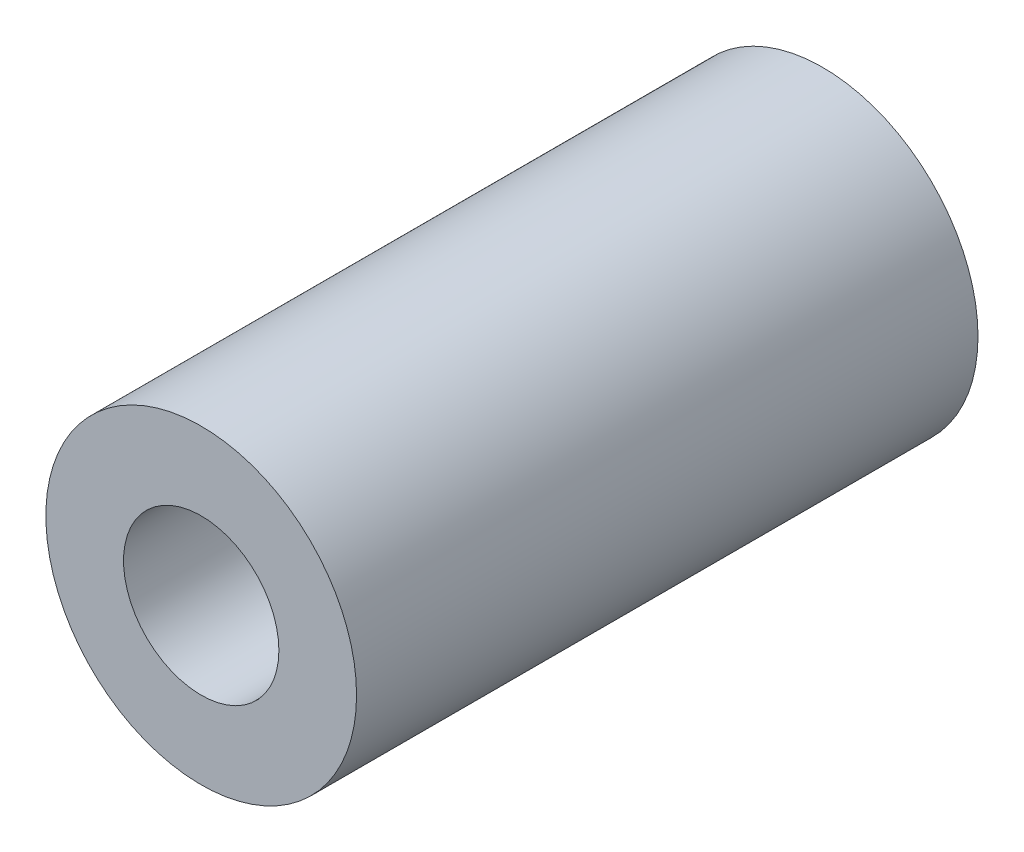
ISO-10303-21;
HEADER;
FILE_DESCRIPTION(('STEP AP214'),'2;1');
FILE_NAME('part.step','',(''),(''),'','','');
FILE_SCHEMA(('AUTOMOTIVE_DESIGN { 1 0 10303 214 1 1 1 1 }'));
ENDSEC;
DATA;
#1=APPLICATION_CONTEXT('core data for automotive mechanical design processes');
#2=APPLICATION_PROTOCOL_DEFINITION('international standard','automotive_design',2000,#1);
#3=PRODUCT_CONTEXT('',#1,'mechanical');
#4=PRODUCT('Part','Part','',(#3));
#5=PRODUCT_RELATED_PRODUCT_CATEGORY('part','',(#4));
#6=PRODUCT_DEFINITION_FORMATION('','',#4);
#7=PRODUCT_DEFINITION_CONTEXT('part definition',#1,'design');
#8=PRODUCT_DEFINITION('design','',#6,#7);
#9=PRODUCT_DEFINITION_SHAPE('','',#8);
#10=(LENGTH_UNIT() NAMED_UNIT(*) SI_UNIT(.MILLI.,.METRE.));
#11=(NAMED_UNIT(*) PLANE_ANGLE_UNIT() SI_UNIT($,.RADIAN.));
#12=(NAMED_UNIT(*) SI_UNIT($,.STERADIAN.) SOLID_ANGLE_UNIT());
#13=UNCERTAINTY_MEASURE_WITH_UNIT(LENGTH_MEASURE(1.E-05),#10,'distance_accuracy_value','');
#14=(GEOMETRIC_REPRESENTATION_CONTEXT(3) GLOBAL_UNCERTAINTY_ASSIGNED_CONTEXT((#13)) GLOBAL_UNIT_ASSIGNED_CONTEXT((#10,
#11,#12)) REPRESENTATION_CONTEXT('',''));
#15=CARTESIAN_POINT('',(0.,0.,0.));
#16=DIRECTION('',(0.,0.,1.));
#17=DIRECTION('',(1.,0.,0.));
#18=AXIS2_PLACEMENT_3D('',#15,#16,#17);
#19=CARTESIAN_POINT('',(0.,0.,20.32));
#20=DIRECTION('',(0.,0.,1.));
#21=DIRECTION('',(1.,0.,0.));
#22=AXIS2_PLACEMENT_3D('',#19,#20,#21);
#23=PLANE('',#22);
#24=CARTESIAN_POINT('',(0.,0.,20.32));
#25=DIRECTION('',(0.,0.,1.));
#26=DIRECTION('',(1.,0.,0.));
#27=AXIS2_PLACEMENT_3D('',#24,#25,#26);
#28=CIRCLE('',#27,5.08);
#29=CARTESIAN_POINT('',(5.08,0.,20.32));
#30=VERTEX_POINT('',#29);
#31=EDGE_CURVE('E10',#30,#30,#28,.T.);
#32=ORIENTED_EDGE('',*,*,#31,.T.);
#33=EDGE_LOOP('',(#32));
#34=FACE_BOUND('',#33,.T.);
#35=CARTESIAN_POINT('',(0.,0.,20.32));
#36=DIRECTION('',(0.,0.,1.));
#37=DIRECTION('',(1.,0.,0.));
#38=AXIS2_PLACEMENT_3D('',#35,#36,#37);
#39=CIRCLE('',#38,2.54);
#40=CARTESIAN_POINT('',(2.54,0.,20.32));
#41=VERTEX_POINT('',#40);
#42=EDGE_CURVE('E56',#41,#41,#39,.T.);
#43=ORIENTED_EDGE('',*,*,#42,.F.);
#44=EDGE_LOOP('',(#43));
#45=FACE_BOUND('',#44,.T.);
#46=ADVANCED_FACE('F43',(#34,#45),#23,.T.);
#47=CARTESIAN_POINT('',(0.,0.,0.));
#48=DIRECTION('',(0.,0.,1.));
#49=DIRECTION('',(1.,0.,0.));
#50=AXIS2_PLACEMENT_3D('',#47,#48,#49);
#51=PLANE('',#50);
#52=CARTESIAN_POINT('',(0.,0.,0.));
#53=DIRECTION('',(0.,0.,1.));
#54=DIRECTION('',(1.,0.,0.));
#55=AXIS2_PLACEMENT_3D('',#52,#53,#54);
#56=CIRCLE('',#55,5.08);
#57=CARTESIAN_POINT('',(5.08,0.,0.));
#58=VERTEX_POINT('',#57);
#59=EDGE_CURVE('E47',#58,#58,#56,.T.);
#60=ORIENTED_EDGE('',*,*,#59,.F.);
#61=EDGE_LOOP('',(#60));
#62=FACE_BOUND('',#61,.T.);
#63=CARTESIAN_POINT('',(0.,0.,0.));
#64=DIRECTION('',(0.,0.,1.));
#65=DIRECTION('',(1.,0.,0.));
#66=AXIS2_PLACEMENT_3D('',#63,#64,#65);
#67=CIRCLE('',#66,2.54);
#68=CARTESIAN_POINT('',(2.54,0.,0.));
#69=VERTEX_POINT('',#68);
#70=EDGE_CURVE('E58',#69,#69,#67,.T.);
#71=ORIENTED_EDGE('',*,*,#70,.T.);
#72=EDGE_LOOP('',(#71));
#73=FACE_BOUND('',#72,.T.);
#74=ADVANCED_FACE('F70',(#62,#73),#51,.F.);
#75=CARTESIAN_POINT('',(0.,0.,20.32));
#76=DIRECTION('',(0.,0.,-1.));
#77=DIRECTION('',(-1.,0.,0.));
#78=AXIS2_PLACEMENT_3D('',#75,#76,#77);
#79=CYLINDRICAL_SURFACE('',#78,5.08);
#80=ORIENTED_EDGE('',*,*,#31,.F.);
#81=EDGE_LOOP('',(#80));
#82=FACE_BOUND('',#81,.T.);
#83=ORIENTED_EDGE('',*,*,#59,.T.);
#84=EDGE_LOOP('',(#83));
#85=FACE_BOUND('',#84,.T.);
#86=ADVANCED_FACE('F45',(#82,#85),#79,.T.);
#87=CARTESIAN_POINT('',(0.,0.,20.32));
#88=DIRECTION('',(0.,0.,-1.));
#89=DIRECTION('',(-1.,0.,0.));
#90=AXIS2_PLACEMENT_3D('',#87,#88,#89);
#91=CYLINDRICAL_SURFACE('',#90,2.54);
#92=ORIENTED_EDGE('',*,*,#42,.T.);
#93=EDGE_LOOP('',(#92));
#94=FACE_BOUND('',#93,.T.);
#95=ORIENTED_EDGE('',*,*,#70,.F.);
#96=EDGE_LOOP('',(#95));
#97=FACE_BOUND('',#96,.T.);
#98=ADVANCED_FACE('F66',(#94,#97),#91,.F.);
#99=CLOSED_SHELL('',(#46,#74,#86,#98));
#100=MANIFOLD_SOLID_BREP('B2',#99);
#101=ADVANCED_BREP_SHAPE_REPRESENTATION('',(#18,#100),#14);
#102=SHAPE_DEFINITION_REPRESENTATION(#9,#101);
ENDSEC;
END-ISO-10303-21;
